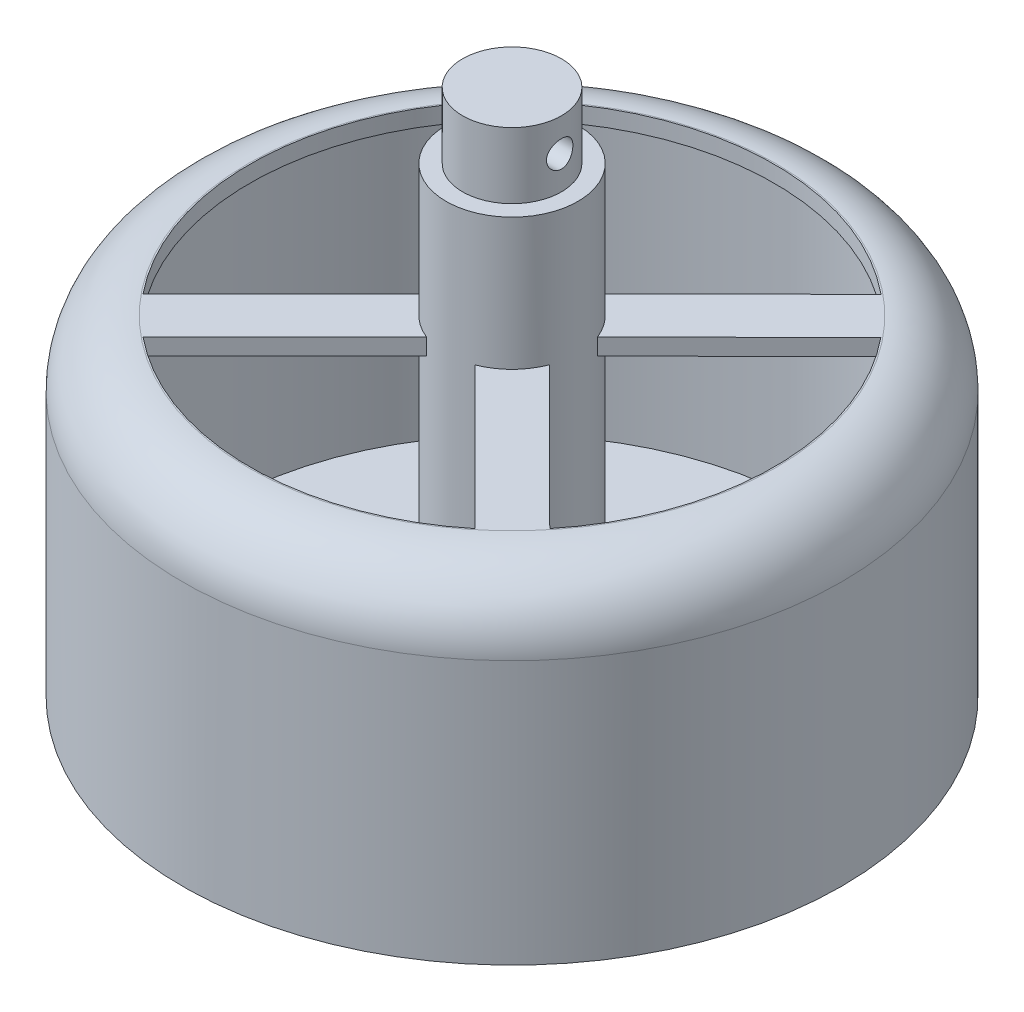
ISO-10303-21;
HEADER;
FILE_DESCRIPTION(('STEP AP214'),'2;1');
FILE_NAME('part.step','',(''),(''),'','','');
FILE_SCHEMA(('AUTOMOTIVE_DESIGN { 1 0 10303 214 1 1 1 1 }'));
ENDSEC;
DATA;
#1=APPLICATION_CONTEXT('core data for automotive mechanical design processes');
#2=APPLICATION_PROTOCOL_DEFINITION('international standard','automotive_design',2000,#1);
#3=PRODUCT_CONTEXT('',#1,'mechanical');
#4=PRODUCT('Part','Part','',(#3));
#5=PRODUCT_RELATED_PRODUCT_CATEGORY('part','',(#4));
#6=PRODUCT_DEFINITION_FORMATION('','',#4);
#7=PRODUCT_DEFINITION_CONTEXT('part definition',#1,'design');
#8=PRODUCT_DEFINITION('design','',#6,#7);
#9=PRODUCT_DEFINITION_SHAPE('','',#8);
#10=(LENGTH_UNIT() NAMED_UNIT(*) SI_UNIT(.MILLI.,.METRE.));
#11=(NAMED_UNIT(*) PLANE_ANGLE_UNIT() SI_UNIT($,.RADIAN.));
#12=(NAMED_UNIT(*) SI_UNIT($,.STERADIAN.) SOLID_ANGLE_UNIT());
#13=UNCERTAINTY_MEASURE_WITH_UNIT(LENGTH_MEASURE(1.E-05),#10,'distance_accuracy_value','');
#14=(GEOMETRIC_REPRESENTATION_CONTEXT(3) GLOBAL_UNCERTAINTY_ASSIGNED_CONTEXT((#13)) GLOBAL_UNIT_ASSIGNED_CONTEXT((#10,
#11,#12)) REPRESENTATION_CONTEXT('',''));
#15=CARTESIAN_POINT('',(0.,0.,0.));
#16=DIRECTION('',(0.,0.,1.));
#17=DIRECTION('',(1.,0.,0.));
#18=AXIS2_PLACEMENT_3D('',#15,#16,#17);
#19=CARTESIAN_POINT('',(50.,25.0000000000001,0.));
#20=DIRECTION('',(0.,1.,0.));
#21=DIRECTION('',(-1.,0.,0.));
#22=AXIS2_PLACEMENT_3D('',#19,#20,#21);
#23=PLANE('',#22);
#24=CARTESIAN_POINT('',(-1.70002900645727E-13,24.9999999999999,0.));
#25=DIRECTION('',(0.,1.,0.));
#26=DIRECTION('',(-1.,0.,0.));
#27=AXIS2_PLACEMENT_3D('',#24,#25,#26);
#28=CIRCLE('',#27,40.0000000000001);
#29=CARTESIAN_POINT('',(-40.0000000000002,24.9999999999998,0.));
#30=VERTEX_POINT('',#29);
#31=EDGE_CURVE('E150',#30,#30,#28,.T.);
#32=ORIENTED_EDGE('',*,*,#31,.T.);
#33=EDGE_LOOP('',(#32));
#34=FACE_BOUND('',#33,.T.);
#35=CARTESIAN_POINT('',(0.,24.9999999999999,0.));
#36=DIRECTION('',(0.,1.,0.));
#37=DIRECTION('',(-1.,0.,0.));
#38=AXIS2_PLACEMENT_3D('',#35,#36,#37);
#39=CIRCLE('',#38,39.7856298685077);
#40=CARTESIAN_POINT('',(-25.1987849511295,24.9999999999999,30.7882701855856));
#41=VERTEX_POINT('',#40);
#42=CARTESIAN_POINT('',(25.1987849511294,25.,30.7882701855856));
#43=VERTEX_POINT('',#42);
#44=EDGE_CURVE('E554',#41,#43,#39,.T.);
#45=ORIENTED_EDGE('',*,*,#44,.F.);
#46=DIRECTION('',(0.707957179278393,0.,-0.706255359135901));
#47=VECTOR('',#46,1.);
#48=CARTESIAN_POINT('',(2.82502143654353,24.9999999999999,2.83182871711357));
#49=LINE('',#48,#47);
#50=CARTESIAN_POINT('',(-3.66351328911779,24.9999999999999,9.30476600353055));
#51=VERTEX_POINT('',#50);
#52=EDGE_CURVE('E157',#41,#51,#49,.T.);
#53=ORIENTED_EDGE('',*,*,#52,.T.);
#54=CARTESIAN_POINT('',(0.,24.9999999999999,0.));
#55=DIRECTION('',(0.,1.,0.));
#56=DIRECTION('',(-1.,0.,0.));
#57=AXIS2_PLACEMENT_3D('',#54,#55,#56);
#58=CIRCLE('',#57,10.);
#59=CARTESIAN_POINT('',(-9.313556162205,24.9999999999999,3.64110856930341));
#60=VERTEX_POINT('',#59);
#61=EDGE_CURVE('E339',#60,#51,#58,.T.);
#62=ORIENTED_EDGE('',*,*,#61,.F.);
#63=DIRECTION('',(-0.707957179278394,0.,0.706255359135901));
#64=VECTOR('',#63,1.);
#65=CARTESIAN_POINT('',(-2.82502143654367,24.9999999999999,-2.83182871711357));
#66=LINE('',#65,#64);
#67=CARTESIAN_POINT('',(-30.8488278242167,24.9999999999998,25.1246127513585));
#68=VERTEX_POINT('',#67);
#69=EDGE_CURVE('E536',#60,#68,#66,.T.);
#70=ORIENTED_EDGE('',*,*,#69,.T.);
#71=CARTESIAN_POINT('',(0.,24.9999999999999,0.));
#72=DIRECTION('',(0.,1.,0.));
#73=DIRECTION('',(-1.,0.,0.));
#74=AXIS2_PLACEMENT_3D('',#71,#72,#73);
#75=CIRCLE('',#74,39.7856298685077);
#76=CARTESIAN_POINT('',(-30.8488278242167,24.9999999999998,-25.1246127513585));
#77=VERTEX_POINT('',#76);
#78=EDGE_CURVE('E530',#77,#68,#75,.T.);
#79=ORIENTED_EDGE('',*,*,#78,.F.);
#80=DIRECTION('',(-0.707957179278394,0.,-0.706255359135901));
#81=VECTOR('',#80,1.);
#82=CARTESIAN_POINT('',(-2.82502143654367,24.9999999999999,2.83182871711357));
#83=LINE('',#82,#81);
#84=CARTESIAN_POINT('',(-9.313556162205,24.9999999999999,-3.64110856930341));
#85=VERTEX_POINT('',#84);
#86=EDGE_CURVE('E270',#85,#77,#83,.T.);
#87=ORIENTED_EDGE('',*,*,#86,.F.);
#88=CARTESIAN_POINT('',(-3.66351328911779,24.9999999999999,-9.30476600353055));
#89=VERTEX_POINT('',#88);
#90=EDGE_CURVE('E344',#89,#85,#58,.T.);
#91=ORIENTED_EDGE('',*,*,#90,.F.);
#92=DIRECTION('',(0.707957179278393,0.,0.706255359135901));
#93=VECTOR('',#92,1.);
#94=CARTESIAN_POINT('',(2.82502143654353,24.9999999999999,-2.83182871711357));
#95=LINE('',#94,#93);
#96=CARTESIAN_POINT('',(-25.1987849511295,24.9999999999999,-30.7882701855856));
#97=VERTEX_POINT('',#96);
#98=EDGE_CURVE('E292',#97,#89,#95,.T.);
#99=ORIENTED_EDGE('',*,*,#98,.F.);
#100=CARTESIAN_POINT('',(0.,24.9999999999999,0.));
#101=DIRECTION('',(0.,1.,0.));
#102=DIRECTION('',(-1.,0.,0.));
#103=AXIS2_PLACEMENT_3D('',#100,#101,#102);
#104=CIRCLE('',#103,39.7856298685077);
#105=CARTESIAN_POINT('',(25.1987849511294,25.,-30.7882701855856));
#106=VERTEX_POINT('',#105);
#107=EDGE_CURVE('E287',#106,#97,#104,.T.);
#108=ORIENTED_EDGE('',*,*,#107,.F.);
#109=DIRECTION('',(-0.707957179278394,0.,0.706255359135901));
#110=VECTOR('',#109,1.);
#111=CARTESIAN_POINT('',(-2.82502143654368,24.9999999999999,-2.83182871711358));
#112=LINE('',#111,#110);
#113=CARTESIAN_POINT('',(3.66351328911764,24.9999999999999,-9.30476600353055));
#114=VERTEX_POINT('',#113);
#115=EDGE_CURVE('E307',#106,#114,#112,.T.);
#116=ORIENTED_EDGE('',*,*,#115,.T.);
#117=CARTESIAN_POINT('',(9.31355616220485,25.,-3.64110856930341));
#118=VERTEX_POINT('',#117);
#119=EDGE_CURVE('E514',#118,#114,#58,.T.);
#120=ORIENTED_EDGE('',*,*,#119,.F.);
#121=DIRECTION('',(0.707957179278394,0.,-0.706255359135901));
#122=VECTOR('',#121,1.);
#123=CARTESIAN_POINT('',(2.82502143654353,24.9999999999999,2.83182871711357));
#124=LINE('',#123,#122);
#125=CARTESIAN_POINT('',(30.8488278242166,25.,-25.1246127513585));
#126=VERTEX_POINT('',#125);
#127=EDGE_CURVE('E297',#118,#126,#124,.T.);
#128=ORIENTED_EDGE('',*,*,#127,.T.);
#129=CARTESIAN_POINT('',(0.,24.9999999999999,0.));
#130=DIRECTION('',(0.,1.,0.));
#131=DIRECTION('',(-1.,0.,0.));
#132=AXIS2_PLACEMENT_3D('',#129,#130,#131);
#133=CIRCLE('',#132,39.7856298685077);
#134=CARTESIAN_POINT('',(30.8488278242166,25.,25.1246127513585));
#135=VERTEX_POINT('',#134);
#136=EDGE_CURVE('E575',#135,#126,#133,.T.);
#137=ORIENTED_EDGE('',*,*,#136,.F.);
#138=DIRECTION('',(0.707957179278394,0.,0.706255359135901));
#139=VECTOR('',#138,1.);
#140=CARTESIAN_POINT('',(2.82502143654353,24.9999999999999,-2.83182871711357));
#141=LINE('',#140,#139);
#142=CARTESIAN_POINT('',(9.31355616220485,25.,3.64110856930341));
#143=VERTEX_POINT('',#142);
#144=EDGE_CURVE('E165',#143,#135,#141,.T.);
#145=ORIENTED_EDGE('',*,*,#144,.F.);
#146=CARTESIAN_POINT('',(3.66351328911764,24.9999999999999,9.30476600353055));
#147=VERTEX_POINT('',#146);
#148=EDGE_CURVE('E285',#147,#143,#58,.T.);
#149=ORIENTED_EDGE('',*,*,#148,.F.);
#150=DIRECTION('',(-0.707957179278394,0.,-0.706255359135901));
#151=VECTOR('',#150,1.);
#152=CARTESIAN_POINT('',(-2.82502143654368,24.9999999999999,2.83182871711358));
#153=LINE('',#152,#151);
#154=EDGE_CURVE('E558',#43,#147,#153,.T.);
#155=ORIENTED_EDGE('',*,*,#154,.F.);
#156=EDGE_LOOP('',(#45,#53,#62,#70,#79,#87,#91,#99,#108,#116,#120,#128,#137,#145,#149,#155));
#157=FACE_BOUND('',#156,.T.);
#158=ADVANCED_FACE('F141',(#34,#157),#23,.T.);
#159=CARTESIAN_POINT('',(-1.28022592527089E-13,45.,0.));
#160=DIRECTION('',(0.,1.,0.));
#161=DIRECTION('',(-1.,0.,0.));
#162=AXIS2_PLACEMENT_3D('',#159,#160,#161);
#163=CYLINDRICAL_SURFACE('',#162,7.5);
#164=CARTESIAN_POINT('',(7.22841614740034,50.,2.));
#165=CARTESIAN_POINT('',(7.22841805697237,50.1101759377402,1.99999734315871));
#166=CARTESIAN_POINT('',(7.23096264549659,50.220380000476,1.99086493224743));
#167=CARTESIAN_POINT('',(7.24083561155082,50.4376054215563,1.95464583260237));
#168=CARTESIAN_POINT('',(7.24816638907919,50.544625154978,1.92755013620952));
#169=CARTESIAN_POINT('',(7.26672375176824,50.7523080699467,1.85635845560073));
#170=CARTESIAN_POINT('',(7.27794485684189,50.8529799588284,1.81228637542178));
#171=CARTESIAN_POINT('',(7.30301154920387,51.0455167400598,1.70846784563704));
#172=CARTESIAN_POINT('',(7.31685734034409,51.1373809475069,1.6487201784145));
#173=CARTESIAN_POINT('',(7.34600139553452,51.3119925469877,1.51364847874559));
#174=CARTESIAN_POINT('',(7.36132541116428,51.3944870174644,1.43800297504208));
#175=CARTESIAN_POINT('',(7.39147701436492,51.5457815769511,1.27397427284021));
#176=CARTESIAN_POINT('',(7.40630455033424,51.6145802461417,1.18558975534664));
#177=CARTESIAN_POINT('',(7.43407988468404,51.7375849384029,0.996838170873268));
#178=CARTESIAN_POINT('',(7.44699376262278,51.7915395186328,0.896301819879479));
#179=CARTESIAN_POINT('',(7.46919126211819,51.8816846353672,0.68718304472909));
#180=CARTESIAN_POINT('',(7.47847549576247,51.9178781672815,0.578601980875103));
#181=CARTESIAN_POINT('',(7.49218553576447,51.9706552202357,0.359115961810089));
#182=CARTESIAN_POINT('',(7.4967177675025,51.9876689766259,0.248321224200915));
#183=CARTESIAN_POINT('',(7.50078524617735,52.0029571201071,0.025363553508575));
#184=CARTESIAN_POINT('',(7.50032132946593,52.0012346436301,-0.0867991474385301));
#185=CARTESIAN_POINT('',(7.4945267585975,51.9794021874605,-0.306314237111347));
#186=CARTESIAN_POINT('',(7.48931914026984,51.9597570423637,-0.413716600721112));
#187=CARTESIAN_POINT('',(7.47476748590455,51.903387862218,-0.623641315571057));
#188=CARTESIAN_POINT('',(7.46542321400575,51.8666628533139,-0.726163388180582));
#189=CARTESIAN_POINT('',(7.44346569099877,51.7768201524076,-0.924603945147555));
#190=CARTESIAN_POINT('',(7.43082087877657,51.7235431928992,-1.02044668632954));
#191=CARTESIAN_POINT('',(7.40362468509489,51.6022311804909,-1.20198999876452));
#192=CARTESIAN_POINT('',(7.38907293222985,51.5341932509718,-1.28768858808586));
#193=CARTESIAN_POINT('',(7.35911272938704,51.382823142066,-1.44928536946561));
#194=CARTESIAN_POINT('',(7.34369169368724,51.2990855549506,-1.52480192017773));
#195=CARTESIAN_POINT('',(7.31413405023506,51.1199753237611,-1.66081332104769));
#196=CARTESIAN_POINT('',(7.29999752083051,51.0246019707995,-1.72130725529808));
#197=CARTESIAN_POINT('',(7.27455902280762,50.8240998981786,-1.82584679186274));
#198=CARTESIAN_POINT('',(7.26327507092141,50.7189146490868,-1.86978866600526));
#199=CARTESIAN_POINT('',(7.24504325087501,50.502273500545,-1.93924001685674));
#200=CARTESIAN_POINT('',(7.23809430746831,50.3908191635496,-1.96475406461341));
#201=CARTESIAN_POINT('',(7.22954835612961,50.1683727889716,-1.99596757092855));
#202=CARTESIAN_POINT('',(7.22779763213442,50.0574664513786,-2.00223632621177));
#203=CARTESIAN_POINT('',(7.22942578390801,49.8361902271914,-1.9963498112297));
#204=CARTESIAN_POINT('',(7.23280411376424,49.72582028476,-1.98419650172322));
#205=CARTESIAN_POINT('',(7.24416124318851,49.5109434059084,-1.94231271869971));
#206=CARTESIAN_POINT('',(7.25205039699285,49.4063645620627,-1.91292447912922));
#207=CARTESIAN_POINT('',(7.2714526895277,49.20362036864,-1.83778986725474));
#208=CARTESIAN_POINT('',(7.28296630148549,49.1054558585725,-1.79204135876651));
#209=CARTESIAN_POINT('',(7.3086357247297,48.9159450425647,-1.68432905508707));
#210=CARTESIAN_POINT('',(7.3228440487285,48.8247960241102,-1.62203095237924));
#211=CARTESIAN_POINT('',(7.35217841933652,48.6540366982968,-1.48340227987515));
#212=CARTESIAN_POINT('',(7.36730463810224,48.5744285650458,-1.40706907222966));
#213=CARTESIAN_POINT('',(7.39729964884442,48.42664752675,-1.23990378250484));
#214=CARTESIAN_POINT('',(7.41214836523835,48.3588716230214,-1.14871641600884));
#215=CARTESIAN_POINT('',(7.43946670017113,48.2395890125894,-0.955928435940741));
#216=CARTESIAN_POINT('',(7.45193644532891,48.188081439921,-0.854328377018883));
#217=CARTESIAN_POINT('',(7.47301150899247,48.1032703676384,-0.644314134825873));
#218=CARTESIAN_POINT('',(7.48164558480371,48.0698309805565,-0.535957852882338));
#219=CARTESIAN_POINT('',(7.49420303787233,48.0217112719356,-0.31489938473132));
#220=CARTESIAN_POINT('',(7.49812745904966,48.0070267932253,-0.202198167320242));
#221=CARTESIAN_POINT('',(7.50077413437678,47.9970941762585,0.0206420013461514));
#222=CARTESIAN_POINT('',(7.49965226288069,48.0012636808688,0.130753511527865));
#223=CARTESIAN_POINT('',(7.49268490978846,48.0275684935752,0.348648304630718));
#224=CARTESIAN_POINT('',(7.48683960554772,48.049703127117,0.456431674812815));
#225=CARTESIAN_POINT('',(7.47111310390909,48.1109806049185,0.66591012346421));
#226=CARTESIAN_POINT('',(7.46125997189216,48.1500052934724,0.767642011851539));
#227=CARTESIAN_POINT('',(7.4385481651648,48.2438496017462,0.963172098471352));
#228=CARTESIAN_POINT('',(7.42568906899239,48.2986714366128,1.05696918166215));
#229=CARTESIAN_POINT('',(7.39791331224108,48.424258272137,1.23667826867367));
#230=CARTESIAN_POINT('',(7.38295093371621,48.4954093806986,1.32231336173331));
#231=CARTESIAN_POINT('',(7.35284000077242,48.6509027493649,1.48062537156133));
#232=CARTESIAN_POINT('',(7.33769139839707,48.7352484758193,1.55329887243048));
#233=CARTESIAN_POINT('',(7.30853959638842,48.9169683958175,1.68520700232561));
#234=CARTESIAN_POINT('',(7.29456891224632,49.0145883136572,1.74411094261233));
#235=CARTESIAN_POINT('',(7.26981393903458,49.2187063108602,1.84458689030054));
#236=CARTESIAN_POINT('',(7.25902756724933,49.3251985285394,1.88617023367332));
#237=CARTESIAN_POINT('',(7.2433600065386,49.5260813360512,1.94538124252481));
#238=CARTESIAN_POINT('',(7.23780140272181,49.6196012645567,1.96581518399489));
#239=CARTESIAN_POINT('',(7.23032885211556,49.8087405579939,1.9931249429388));
#240=CARTESIAN_POINT('',(7.22841448976002,49.9043596822888,2.0000023063216));
#241=CARTESIAN_POINT('',(7.22841614740034,50.,2.));
#242=B_SPLINE_CURVE_WITH_KNOTS('',3,(#164,#165,#166,#167,#168,#169,#170,#171,#172,#173,#174,
#175,#176,#177,#178,#179,#180,#181,#182,#183,#184,#185,#186,#187,#188,#189,#190,#191,#192,#193,
#194,#195,#196,#197,#198,#199,#200,#201,#202,#203,#204,#205,#206,#207,#208,#209,#210,#211,#212,
#213,#214,#215,#216,#217,#218,#219,#220,#221,#222,#223,#224,#225,#226,#227,#228,#229,#230,#231,
#232,#233,#234,#235,#236,#237,#238,#239,#240,#241),.UNSPECIFIED.,.T.,.F.,(4,2,2,2,2,2,2,2,2,2,2,
2,2,2,2,2,2,2,2,2,2,2,2,2,2,2,2,2,2,2,2,2,2,2,2,2,2,2,4),(0.,0.33017612811603,0.660517947850204,
0.99039631159616,1.32030030656104,1.65765916130211,1.99505297124461,2.33785207370803,
2.68059334304246,3.0154830431648,3.35031668385603,3.67670570800803,4.00311334440696,
4.3327644890557,4.66247993394491,5.00231762300329,5.34217602639579,5.68413015096536,
6.02599942418508,6.35765334242024,6.68927196343503,7.01451850432575,7.33980752864823,
7.67224634967772,8.00474771541475,8.34685906959633,8.68895221008103,9.02843539591401,
9.36784331959006,9.69684054916463,10.0258254261296,10.3525451486866,10.6793107076596,
11.0147885399158,11.3503546538105,11.6933003898558,12.0360213210131,12.3226696767153,
12.6092853429065),.UNSPECIFIED.);
#243=CARTESIAN_POINT('',(7.22841614740034,50.,2.));
#244=VERTEX_POINT('',#243);
#245=EDGE_CURVE('E315',#244,#244,#242,.T.);
#246=ORIENTED_EDGE('',*,*,#245,.T.);
#247=EDGE_LOOP('',(#246));
#248=FACE_BOUND('',#247,.T.);
#249=CARTESIAN_POINT('',(-1.28022592527089E-13,45.,0.));
#250=DIRECTION('',(0.,1.,0.));
#251=DIRECTION('',(-1.,0.,0.));
#252=AXIS2_PLACEMENT_3D('',#249,#250,#251);
#253=CIRCLE('',#252,7.5);
#254=CARTESIAN_POINT('',(-7.50000000000013,44.9999999999999,0.));
#255=VERTEX_POINT('',#254);
#256=EDGE_CURVE('E325',#255,#255,#253,.T.);
#257=ORIENTED_EDGE('',*,*,#256,.T.);
#258=EDGE_LOOP('',(#257));
#259=FACE_BOUND('',#258,.T.);
#260=CARTESIAN_POINT('',(-1.56472057533108E-13,54.9999999999999,0.));
#261=DIRECTION('',(0.,1.,0.));
#262=DIRECTION('',(-1.,0.,0.));
#263=AXIS2_PLACEMENT_3D('',#260,#261,#262);
#264=CIRCLE('',#263,7.5);
#265=CARTESIAN_POINT('',(-7.50000000000016,54.9999999999999,0.));
#266=VERTEX_POINT('',#265);
#267=EDGE_CURVE('E330',#266,#266,#264,.T.);
#268=ORIENTED_EDGE('',*,*,#267,.F.);
#269=EDGE_LOOP('',(#268));
#270=FACE_BOUND('',#269,.T.);
#271=CARTESIAN_POINT('',(-7.50000000000014,47.9999999999999,0.));
#272=CARTESIAN_POINT('',(-7.49999833810175,48.0000026169348,-0.110254555832854));
#273=CARTESIAN_POINT('',(-7.49754486162164,48.0091476141896,-0.22053716022184));
#274=CARTESIAN_POINT('',(-7.48799573621673,48.0454212307386,-0.437925451354464));
#275=CARTESIAN_POINT('',(-7.480897853326,48.0725585044261,-0.545029583319087));
#276=CARTESIAN_POINT('',(-7.46284333252804,48.143871666864,-0.752891589045312));
#277=CARTESIAN_POINT('',(-7.45189167130389,48.188025587666,-0.853657451015282));
#278=CARTESIAN_POINT('',(-7.42728699151692,48.2920372426666,-1.04635368639266));
#279=CARTESIAN_POINT('',(-7.41363379295194,48.3518960233592,-1.13828347044962));
#280=CARTESIAN_POINT('',(-7.38474614902008,48.4870835164133,-1.31282950374002));
#281=CARTESIAN_POINT('',(-7.36948467678695,48.5627086680082,-1.39521168986279));
#282=CARTESIAN_POINT('',(-7.33927409679605,48.7266484830633,-1.54628713660638));
#283=CARTESIAN_POINT('',(-7.32432502947257,48.8149647776175,-1.61497863495665));
#284=CARTESIAN_POINT('',(-7.29615537464386,49.0036482348254,-1.73786409243415));
#285=CARTESIAN_POINT('',(-7.28296888563253,49.1041963282617,-1.79178877736488));
#286=CARTESIAN_POINT('',(-7.26021477318201,49.3133401110924,-1.88187548076994));
#287=CARTESIAN_POINT('',(-7.25064648253279,49.4219343123314,-1.91804077451369));
#288=CARTESIAN_POINT('',(-7.23649115802413,49.641495537825,-1.97076920226504));
#289=CARTESIAN_POINT('',(-7.23179647811504,49.7523535399307,-1.98775670244692));
#290=CARTESIAN_POINT('',(-7.22759830916385,49.9754376833065,-2.0029703470582));
#291=CARTESIAN_POINT('',(-7.2280938501446,50.087663565024,-2.00119999705753));
#292=CARTESIAN_POINT('',(-7.23412378802045,50.306985415374,-1.97928510002699));
#293=CARTESIAN_POINT('',(-7.23951735511545,50.4141371820384,-1.95965406064765));
#294=CARTESIAN_POINT('',(-7.25451013080702,50.6235683344562,-1.90339748722183));
#295=CARTESIAN_POINT('',(-7.26410967552627,50.7258473300753,-1.86677059492995));
#296=CARTESIAN_POINT('',(-7.28655661748401,50.9239681438085,-1.77714356965256));
#297=CARTESIAN_POINT('',(-7.29943942818717,51.0197243392862,-1.72396341137784));
#298=CARTESIAN_POINT('',(-7.32698229642459,51.2011341588515,-1.60286503823778));
#299=CARTESIAN_POINT('',(-7.34164270355201,51.2867857891564,-1.53494392224251));
#300=CARTESIAN_POINT('',(-7.37167510629878,51.4484889974548,-1.38366607263419));
#301=CARTESIAN_POINT('',(-7.38705471488845,51.5241363183149,-1.29987812728299));
#302=CARTESIAN_POINT('',(-7.41636381276331,51.6603887803502,-1.12061766820637));
#303=CARTESIAN_POINT('',(-7.43029324488569,51.7209933287024,-1.02514469420509));
#304=CARTESIAN_POINT('',(-7.45521820398308,51.8256179028246,-0.824598255497455));
#305=CARTESIAN_POINT('',(-7.46620072833575,51.8695647704485,-0.719484902551792));
#306=CARTESIAN_POINT('',(-7.48390044401014,51.9390471888133,-0.503002294390397));
#307=CARTESIAN_POINT('',(-7.49061856733764,51.9645867627239,-0.391634411928326));
#308=CARTESIAN_POINT('',(-7.49889158558399,51.9958948769178,-0.169254083145517));
#309=CARTESIAN_POINT('',(-7.50058997470974,52.0022130398508,-0.0583242376413815));
#310=CARTESIAN_POINT('',(-7.4990447169171,51.996416835753,0.163010045901198));
#311=CARTESIAN_POINT('',(-7.49580158080367,51.9843043738942,0.273414537062114));
#312=CARTESIAN_POINT('',(-7.48483035496036,51.94244155254,0.48860244990178));
#313=CARTESIAN_POINT('',(-7.47718026546344,51.9129977538022,0.593449852027782));
#314=CARTESIAN_POINT('',(-7.45826294894154,51.837664055492,0.796706971176064));
#315=CARTESIAN_POINT('',(-7.44699532996176,51.7917723737494,0.895115989216026));
#316=CARTESIAN_POINT('',(-7.42175660559543,51.6838261128194,1.08483847466795));
#317=CARTESIAN_POINT('',(-7.40773686604971,51.6214725332022,1.17597518846118));
#318=CARTESIAN_POINT('',(-7.37861452365578,51.482748369842,1.34668463539714));
#319=CARTESIAN_POINT('',(-7.36351170727535,51.4063750173989,1.42625507879918));
#320=CARTESIAN_POINT('',(-7.33339745866719,51.2392144225054,1.57388924478774));
#321=CARTESIAN_POINT('',(-7.31840061429327,51.1480814386048,1.64156519249816));
#322=CARTESIAN_POINT('',(-7.29066447182742,50.9554353039003,1.76067191185118));
#323=CARTESIAN_POINT('',(-7.27792507956331,50.8539225863776,1.81210336122161));
#324=CARTESIAN_POINT('',(-7.25629268373224,50.6439046929238,1.89687411586112));
#325=CARTESIAN_POINT('',(-7.24737748318023,50.5354441881824,1.93031812253958));
#326=CARTESIAN_POINT('',(-7.23439825126815,50.3141606803252,1.97841205118791));
#327=CARTESIAN_POINT('',(-7.23033298020028,50.201338799652,1.99306677602478));
#328=CARTESIAN_POINT('',(-7.22761744573603,49.9785052121162,2.00288989653714));
#329=CARTESIAN_POINT('',(-7.22879397743253,49.8685226797417,1.99868155618109));
#330=CARTESIAN_POINT('',(-7.23602396081101,49.6508964859899,1.97234376000439));
#331=CARTESIAN_POINT('',(-7.24207728699453,49.5432527644994,1.95021476535025));
#332=CARTESIAN_POINT('',(-7.25827571073172,49.3341442478701,1.88902515699699));
#333=CARTESIAN_POINT('',(-7.26838885019658,49.2326381572678,1.8500966107558));
#334=CARTESIAN_POINT('',(-7.29156818136191,49.0375211694658,1.75651554562386));
#335=CARTESIAN_POINT('',(-7.30463483621378,48.9439115136994,1.70186056024617));
#336=CARTESIAN_POINT('',(-7.33272921440474,48.7642696405033,1.57648909268817));
#337=CARTESIAN_POINT('',(-7.34780333101704,48.6785414650237,1.50534729767909));
#338=CARTESIAN_POINT('',(-7.37795503783021,48.5200375483326,1.349830535111));
#339=CARTESIAN_POINT('',(-7.39303262798455,48.4472649613311,1.26545235435875));
#340=CARTESIAN_POINT('',(-7.42187812403982,48.3152077623531,1.08367998108869));
#341=CARTESIAN_POINT('',(-7.43561111314564,48.2562449893506,0.986045961751778));
#342=CARTESIAN_POINT('',(-7.45983810102911,48.1556625840706,0.781888640416887));
#343=CARTESIAN_POINT('',(-7.47033417683608,48.1140318243363,0.675371094696294));
#344=CARTESIAN_POINT('',(-7.48554752513481,48.0547247145844,0.474374704880988));
#345=CARTESIAN_POINT('',(-7.49092770592616,48.0342506164075,0.380762016565034));
#346=CARTESIAN_POINT('',(-7.4981544903647,48.0068877938329,0.191439795317076));
#347=CARTESIAN_POINT('',(-7.50000144297284,47.9999977277999,0.0957304704048601));
#348=CARTESIAN_POINT('',(-7.50000000000014,47.9999999999999,0.));
#349=B_SPLINE_CURVE_WITH_KNOTS('',3,(#271,#272,#273,#274,#275,#276,#277,#278,#279,#280,#281,
#282,#283,#284,#285,#286,#287,#288,#289,#290,#291,#292,#293,#294,#295,#296,#297,#298,#299,#300,
#301,#302,#303,#304,#305,#306,#307,#308,#309,#310,#311,#312,#313,#314,#315,#316,#317,#318,#319,
#320,#321,#322,#323,#324,#325,#326,#327,#328,#329,#330,#331,#332,#333,#334,#335,#336,#337,#338,
#339,#340,#341,#342,#343,#344,#345,#346,#347,#348),.UNSPECIFIED.,.T.,.F.,(4,2,2,2,2,2,2,2,2,2,2,
2,2,2,2,2,2,2,2,2,2,2,2,2,2,2,2,2,2,2,2,2,2,2,2,2,2,2,4),(0.,0.330412598949569,0.66098424376145,
0.99113055297193,1.32129886708675,1.65834897954967,1.99544244925149,2.33832582523229,
2.68114594129699,3.01622158250469,3.3512346040432,3.67691002045996,4.00261146812939,
4.33198673346498,4.6614268811763,5.00161259812322,5.34181171937597,5.68348809603041,
6.02508977190138,6.35682717524547,6.68853028925351,7.01453535642116,7.34057575775614,
7.6730028600455,8.00549568258886,8.34736496382788,8.68921998024107,9.02906297699387,
9.36881908663982,9.69743342403611,10.0260393052059,10.352107654483,10.67822717123,
11.0139433957139,11.3497412433245,11.692722522809,12.0354832614518,12.3223981899334,
12.6092847796638),.UNSPECIFIED.);
#350=CARTESIAN_POINT('',(-7.50000000000014,47.9999999999999,0.));
#351=VERTEX_POINT('',#350);
#352=EDGE_CURVE('E334',#351,#351,#349,.T.);
#353=ORIENTED_EDGE('',*,*,#352,.T.);
#354=EDGE_LOOP('',(#353));
#355=FACE_BOUND('',#354,.T.);
#356=ADVANCED_FACE('F368',(#248,#259,#270,#355),#163,.T.);
#357=CARTESIAN_POINT('',(-1.56472057533108E-13,54.9999999999999,0.));
#358=DIRECTION('',(0.,-1.,0.));
#359=DIRECTION('',(1.,0.,0.));
#360=AXIS2_PLACEMENT_3D('',#357,#358,#359);
#361=CYLINDRICAL_SURFACE('',#360,10.);
#362=CARTESIAN_POINT('',(0.,22.4999999999999,0.));
#363=DIRECTION('',(0.,-1.,0.));
#364=DIRECTION('',(1.,0.,0.));
#365=AXIS2_PLACEMENT_3D('',#362,#363,#364);
#366=CIRCLE('',#365,10.);
#367=CARTESIAN_POINT('',(9.31355616220486,22.5,3.64110856930341));
#368=VERTEX_POINT('',#367);
#369=CARTESIAN_POINT('',(3.66351328911765,22.4999999999999,9.30476600353055));
#370=VERTEX_POINT('',#369);
#371=EDGE_CURVE('E257',#368,#370,#366,.T.);
#372=ORIENTED_EDGE('',*,*,#371,.T.);
#373=DIRECTION('',(0.,1.,0.));
#374=VECTOR('',#373,1.);
#375=CARTESIAN_POINT('',(3.66351328911767,15.,9.30476600353055));
#376=LINE('',#375,#374);
#377=EDGE_CURVE('E566',#370,#147,#376,.T.);
#378=ORIENTED_EDGE('',*,*,#377,.T.);
#379=ORIENTED_EDGE('',*,*,#148,.T.);
#380=DIRECTION('',(0.,1.,0.));
#381=VECTOR('',#380,1.);
#382=CARTESIAN_POINT('',(9.31355616220488,15.,3.64110856930341));
#383=LINE('',#382,#381);
#384=EDGE_CURVE('E275',#368,#143,#383,.T.);
#385=ORIENTED_EDGE('',*,*,#384,.F.);
#386=EDGE_LOOP('',(#372,#378,#379,#385));
#387=FACE_BOUND('',#386,.T.);
#388=CARTESIAN_POINT('',(-3.66351328911778,22.4999999999999,9.30476600353055));
#389=VERTEX_POINT('',#388);
#390=CARTESIAN_POINT('',(-9.31355616220499,22.4999999999999,3.64110856930341));
#391=VERTEX_POINT('',#390);
#392=EDGE_CURVE('E271',#389,#391,#366,.T.);
#393=ORIENTED_EDGE('',*,*,#392,.T.);
#394=DIRECTION('',(0.,1.,0.));
#395=VECTOR('',#394,1.);
#396=CARTESIAN_POINT('',(-9.31355616220497,14.9999999999999,3.64110856930341));
#397=LINE('',#396,#395);
#398=EDGE_CURVE('E544',#391,#60,#397,.T.);
#399=ORIENTED_EDGE('',*,*,#398,.T.);
#400=ORIENTED_EDGE('',*,*,#61,.T.);
#401=DIRECTION('',(0.,1.,0.));
#402=VECTOR('',#401,1.);
#403=CARTESIAN_POINT('',(-3.66351328911776,14.9999999999999,9.30476600353055));
#404=LINE('',#403,#402);
#405=EDGE_CURVE('E563',#389,#51,#404,.T.);
#406=ORIENTED_EDGE('',*,*,#405,.F.);
#407=EDGE_LOOP('',(#393,#399,#400,#406));
#408=FACE_BOUND('',#407,.T.);
#409=CARTESIAN_POINT('',(-9.31355616220499,22.4999999999999,-3.64110856930341));
#410=VERTEX_POINT('',#409);
#411=CARTESIAN_POINT('',(-3.66351328911778,22.4999999999999,-9.30476600353055));
#412=VERTEX_POINT('',#411);
#413=EDGE_CURVE('E588',#410,#412,#366,.T.);
#414=ORIENTED_EDGE('',*,*,#413,.T.);
#415=DIRECTION('',(0.,1.,0.));
#416=VECTOR('',#415,1.);
#417=CARTESIAN_POINT('',(-3.66351328911776,14.9999999999999,-9.30476600353055));
#418=LINE('',#417,#416);
#419=EDGE_CURVE('E319',#412,#89,#418,.T.);
#420=ORIENTED_EDGE('',*,*,#419,.T.);
#421=ORIENTED_EDGE('',*,*,#90,.T.);
#422=DIRECTION('',(0.,1.,0.));
#423=VECTOR('',#422,1.);
#424=CARTESIAN_POINT('',(-9.31355616220497,14.9999999999999,-3.64110856930341));
#425=LINE('',#424,#423);
#426=EDGE_CURVE('E524',#410,#85,#425,.T.);
#427=ORIENTED_EDGE('',*,*,#426,.F.);
#428=EDGE_LOOP('',(#414,#420,#421,#427));
#429=FACE_BOUND('',#428,.T.);
#430=DIRECTION('',(0.,1.,0.));
#431=VECTOR('',#430,1.);
#432=CARTESIAN_POINT('',(3.66351328911767,15.,-9.30476600353055));
#433=LINE('',#432,#431);
#434=CARTESIAN_POINT('',(3.66351328911765,22.4999999999999,-9.30476600353055));
#435=VERTEX_POINT('',#434);
#436=EDGE_CURVE('E316',#435,#114,#433,.T.);
#437=ORIENTED_EDGE('',*,*,#436,.F.);
#438=CARTESIAN_POINT('',(9.31355616220486,22.5,-3.64110856930341));
#439=VERTEX_POINT('',#438);
#440=EDGE_CURVE('E273',#435,#439,#366,.T.);
#441=ORIENTED_EDGE('',*,*,#440,.T.);
#442=DIRECTION('',(0.,1.,0.));
#443=VECTOR('',#442,1.);
#444=CARTESIAN_POINT('',(9.31355616220488,15.,-3.64110856930341));
#445=LINE('',#444,#443);
#446=EDGE_CURVE('E288',#439,#118,#445,.T.);
#447=ORIENTED_EDGE('',*,*,#446,.T.);
#448=ORIENTED_EDGE('',*,*,#119,.T.);
#449=EDGE_LOOP('',(#437,#441,#447,#448));
#450=FACE_BOUND('',#449,.T.);
#451=CARTESIAN_POINT('',(-1.28022592527089E-13,45.,0.));
#452=DIRECTION('',(0.,1.,0.));
#453=DIRECTION('',(-1.,0.,0.));
#454=AXIS2_PLACEMENT_3D('',#451,#452,#453);
#455=CIRCLE('',#454,10.);
#456=CARTESIAN_POINT('',(-10.0000000000001,44.9999999999999,0.));
#457=VERTEX_POINT('',#456);
#458=EDGE_CURVE('E329',#457,#457,#455,.T.);
#459=ORIENTED_EDGE('',*,*,#458,.F.);
#460=EDGE_LOOP('',(#459));
#461=FACE_BOUND('',#460,.T.);
#462=CARTESIAN_POINT('',(0.,-22.5000000000001,0.));
#463=DIRECTION('',(0.,1.,0.));
#464=DIRECTION('',(-1.,0.,0.));
#465=AXIS2_PLACEMENT_3D('',#462,#463,#464);
#466=CIRCLE('',#465,10.);
#467=CARTESIAN_POINT('',(-9.99999999999994,-22.5000000000001,0.));
#468=VERTEX_POINT('',#467);
#469=EDGE_CURVE('E12',#468,#468,#466,.T.);
#470=ORIENTED_EDGE('',*,*,#469,.T.);
#471=EDGE_LOOP('',(#470));
#472=FACE_BOUND('',#471,.T.);
#473=ADVANCED_FACE('F282',(#387,#408,#429,#450,#461,#472),#361,.T.);
#474=CARTESIAN_POINT('',(0.,-25.,0.));
#475=DIRECTION('',(0.,-1.,0.));
#476=DIRECTION('',(1.,0.,0.));
#477=AXIS2_PLACEMENT_3D('',#474,#475,#476);
#478=CYLINDRICAL_SURFACE('',#477,50.0000000000001);
#479=CARTESIAN_POINT('',(-1.41553435639708E-13,14.9999999999999,0.));
#480=DIRECTION('',(0.,1.,0.));
#481=DIRECTION('',(-1.,0.,0.));
#482=AXIS2_PLACEMENT_3D('',#479,#480,#481);
#483=CIRCLE('',#482,50.0000000000001);
#484=CARTESIAN_POINT('',(-50.0000000000002,14.9999999999998,0.));
#485=VERTEX_POINT('',#484);
#486=EDGE_CURVE('E460',#485,#485,#483,.F.);
#487=ORIENTED_EDGE('',*,*,#486,.T.);
#488=EDGE_LOOP('',(#487));
#489=FACE_BOUND('',#488,.T.);
#490=CARTESIAN_POINT('',(0.,-25.0000000000001,0.));
#491=DIRECTION('',(0.,-1.,0.));
#492=DIRECTION('',(1.,0.,0.));
#493=AXIS2_PLACEMENT_3D('',#490,#491,#492);
#494=CIRCLE('',#493,50.);
#495=CARTESIAN_POINT('',(50.,-25.,0.));
#496=VERTEX_POINT('',#495);
#497=EDGE_CURVE('E352',#496,#496,#494,.T.);
#498=ORIENTED_EDGE('',*,*,#497,.F.);
#499=EDGE_LOOP('',(#498));
#500=FACE_BOUND('',#499,.T.);
#501=ADVANCED_FACE('F450',(#489,#500),#478,.T.);
#502=CARTESIAN_POINT('',(50.,-24.9999999999999,0.));
#503=DIRECTION('',(0.,-1.,0.));
#504=DIRECTION('',(1.,0.,0.));
#505=AXIS2_PLACEMENT_3D('',#502,#503,#504);
#506=PLANE('',#505);
#507=ORIENTED_EDGE('',*,*,#497,.T.);
#508=EDGE_LOOP('',(#507));
#509=FACE_BOUND('',#508,.T.);
#510=ADVANCED_FACE('F447',(#509),#506,.T.);
#511=CARTESIAN_POINT('',(-1.28022592527089E-13,45.,0.));
#512=DIRECTION('',(0.,1.,0.));
#513=DIRECTION('',(-1.,0.,0.));
#514=AXIS2_PLACEMENT_3D('',#511,#512,#513);
#515=PLANE('',#514);
#516=ORIENTED_EDGE('',*,*,#256,.F.);
#517=EDGE_LOOP('',(#516));
#518=FACE_BOUND('',#517,.T.);
#519=ORIENTED_EDGE('',*,*,#458,.T.);
#520=EDGE_LOOP('',(#519));
#521=FACE_BOUND('',#520,.T.);
#522=ADVANCED_FACE('F449',(#518,#521),#515,.T.);
#523=CARTESIAN_POINT('',(-1.56472057533108E-13,54.9999999999999,0.));
#524=DIRECTION('',(0.,1.,0.));
#525=DIRECTION('',(-1.,0.,0.));
#526=AXIS2_PLACEMENT_3D('',#523,#524,#525);
#527=PLANE('',#526);
#528=ORIENTED_EDGE('',*,*,#267,.T.);
#529=EDGE_LOOP('',(#528));
#530=FACE_BOUND('',#529,.T.);
#531=ADVANCED_FACE('F376',(#530),#527,.T.);
#532=CARTESIAN_POINT('',(9.99999999999998,50.,0.));
#533=DIRECTION('',(-1.,0.,0.));
#534=DIRECTION('',(0.,0.,1.));
#535=AXIS2_PLACEMENT_3D('',#532,#533,#534);
#536=CYLINDRICAL_SURFACE('',#535,2.);
#537=ORIENTED_EDGE('',*,*,#352,.F.);
#538=EDGE_LOOP('',(#537));
#539=FACE_BOUND('',#538,.T.);
#540=ORIENTED_EDGE('',*,*,#245,.F.);
#541=EDGE_LOOP('',(#540));
#542=FACE_BOUND('',#541,.T.);
#543=ADVANCED_FACE('F371',(#539,#542),#536,.F.);
#544=CARTESIAN_POINT('',(0.,15.,0.));
#545=DIRECTION('',(0.,1.,0.));
#546=DIRECTION('',(-1.,0.,0.));
#547=AXIS2_PLACEMENT_3D('',#544,#545,#546);
#548=CYLINDRICAL_SURFACE('',#547,39.7856298685077);
#549=CARTESIAN_POINT('',(0.,22.4999999999999,0.));
#550=DIRECTION('',(0.,-1.,0.));
#551=DIRECTION('',(1.,0.,0.));
#552=AXIS2_PLACEMENT_3D('',#549,#550,#551);
#553=CIRCLE('',#552,39.7856298685077);
#554=CARTESIAN_POINT('',(-25.1987849511295,22.4999999999999,-30.7882701855856));
#555=VERTEX_POINT('',#554);
#556=CARTESIAN_POINT('',(25.1987849511294,22.5,-30.7882701855856));
#557=VERTEX_POINT('',#556);
#558=EDGE_CURVE('E492',#555,#557,#553,.T.);
#559=ORIENTED_EDGE('',*,*,#558,.T.);
#560=DIRECTION('',(0.,1.,0.));
#561=VECTOR('',#560,1.);
#562=CARTESIAN_POINT('',(25.1987849511294,15.,-30.7882701855856));
#563=LINE('',#562,#561);
#564=EDGE_CURVE('E312',#557,#106,#563,.T.);
#565=ORIENTED_EDGE('',*,*,#564,.T.);
#566=ORIENTED_EDGE('',*,*,#107,.T.);
#567=DIRECTION('',(0.,1.,0.));
#568=VECTOR('',#567,1.);
#569=CARTESIAN_POINT('',(-25.1987849511295,14.9999999999999,-30.7882701855856));
#570=LINE('',#569,#568);
#571=EDGE_CURVE('E311',#555,#97,#570,.T.);
#572=ORIENTED_EDGE('',*,*,#571,.F.);
#573=EDGE_LOOP('',(#559,#565,#566,#572));
#574=FACE_BOUND('',#573,.T.);
#575=ADVANCED_FACE('F375',(#574),#548,.F.);
#576=CARTESIAN_POINT('',(-2.82502143654365,14.9999999999999,-2.83182871711358));
#577=DIRECTION('',(-0.706255359135901,0.,-0.707957179278393));
#578=DIRECTION('',(-0.707957179278394,0.,0.706255359135901));
#579=AXIS2_PLACEMENT_3D('',#576,#577,#578);
#580=PLANE('',#579);
#581=ORIENTED_EDGE('',*,*,#436,.T.);
#582=ORIENTED_EDGE('',*,*,#115,.F.);
#583=ORIENTED_EDGE('',*,*,#564,.F.);
#584=DIRECTION('',(0.707957179278394,0.,-0.706255359135901));
#585=VECTOR('',#584,1.);
#586=CARTESIAN_POINT('',(-2.82502143654366,22.4999999999999,-2.83182871711359));
#587=LINE('',#586,#585);
#588=EDGE_CURVE('E495',#435,#557,#587,.T.);
#589=ORIENTED_EDGE('',*,*,#588,.F.);
#590=EDGE_LOOP('',(#581,#582,#583,#589));
#591=FACE_BOUND('',#590,.T.);
#592=ADVANCED_FACE('F381',(#591),#580,.T.);
#593=CARTESIAN_POINT('',(2.82502143654356,15.,-2.83182871711357));
#594=DIRECTION('',(-0.706255359135901,0.,0.707957179278393));
#595=DIRECTION('',(0.707957179278393,0.,0.706255359135901));
#596=AXIS2_PLACEMENT_3D('',#593,#594,#595);
#597=PLANE('',#596);
#598=DIRECTION('',(-0.707957179278393,0.,-0.706255359135901));
#599=VECTOR('',#598,1.);
#600=CARTESIAN_POINT('',(2.82502143654355,22.4999999999999,-2.83182871711356));
#601=LINE('',#600,#599);
#602=EDGE_CURVE('E343',#412,#555,#601,.T.);
#603=ORIENTED_EDGE('',*,*,#602,.T.);
#604=ORIENTED_EDGE('',*,*,#571,.T.);
#605=ORIENTED_EDGE('',*,*,#98,.T.);
#606=ORIENTED_EDGE('',*,*,#419,.F.);
#607=EDGE_LOOP('',(#603,#604,#605,#606));
#608=FACE_BOUND('',#607,.T.);
#609=ADVANCED_FACE('F383',(#608),#597,.F.);
#610=CARTESIAN_POINT('',(-2.82502143654364,14.9999999999999,2.83182871711357));
#611=DIRECTION('',(0.706255359135901,0.,-0.707957179278394));
#612=DIRECTION('',(-0.707957179278394,0.,-0.706255359135901));
#613=AXIS2_PLACEMENT_3D('',#610,#611,#612);
#614=PLANE('',#613);
#615=DIRECTION('',(0.707957179278394,0.,0.706255359135901));
#616=VECTOR('',#615,1.);
#617=CARTESIAN_POINT('',(-2.82502143654365,22.4999999999999,2.83182871711358));
#618=LINE('',#617,#616);
#619=CARTESIAN_POINT('',(-30.8488278242167,22.5,-25.1246127513585));
#620=VERTEX_POINT('',#619);
#621=EDGE_CURVE('E481',#620,#410,#618,.T.);
#622=ORIENTED_EDGE('',*,*,#621,.T.);
#623=ORIENTED_EDGE('',*,*,#426,.T.);
#624=ORIENTED_EDGE('',*,*,#86,.T.);
#625=DIRECTION('',(0.,1.,0.));
#626=VECTOR('',#625,1.);
#627=CARTESIAN_POINT('',(-30.8488278242167,14.9999999999999,-25.1246127513585));
#628=LINE('',#627,#626);
#629=EDGE_CURVE('E541',#620,#77,#628,.T.);
#630=ORIENTED_EDGE('',*,*,#629,.F.);
#631=EDGE_LOOP('',(#622,#623,#624,#630));
#632=FACE_BOUND('',#631,.T.);
#633=ADVANCED_FACE('F386',(#632),#614,.F.);
#634=CARTESIAN_POINT('',(-2.82502143654364,14.9999999999999,-2.83182871711357));
#635=DIRECTION('',(-0.706255359135901,0.,-0.707957179278394));
#636=DIRECTION('',(-0.707957179278394,0.,0.706255359135901));
#637=AXIS2_PLACEMENT_3D('',#634,#635,#636);
#638=PLANE('',#637);
#639=DIRECTION('',(0.,1.,0.));
#640=VECTOR('',#639,1.);
#641=CARTESIAN_POINT('',(-30.8488278242167,14.9999999999999,25.1246127513585));
#642=LINE('',#641,#640);
#643=CARTESIAN_POINT('',(-30.8488278242167,22.4999999999999,25.1246127513585));
#644=VERTEX_POINT('',#643);
#645=EDGE_CURVE('E547',#644,#68,#642,.T.);
#646=ORIENTED_EDGE('',*,*,#645,.T.);
#647=ORIENTED_EDGE('',*,*,#69,.F.);
#648=ORIENTED_EDGE('',*,*,#398,.F.);
#649=DIRECTION('',(0.707957179278394,0.,-0.706255359135901));
#650=VECTOR('',#649,1.);
#651=CARTESIAN_POINT('',(-2.82502143654365,22.4999999999999,-2.83182871711358));
#652=LINE('',#651,#650);
#653=EDGE_CURVE('E485',#644,#391,#652,.T.);
#654=ORIENTED_EDGE('',*,*,#653,.F.);
#655=EDGE_LOOP('',(#646,#647,#648,#654));
#656=FACE_BOUND('',#655,.T.);
#657=ADVANCED_FACE('F415',(#656),#638,.T.);
#658=CARTESIAN_POINT('',(0.,15.,0.));
#659=DIRECTION('',(0.,1.,0.));
#660=DIRECTION('',(-1.,0.,0.));
#661=AXIS2_PLACEMENT_3D('',#658,#659,#660);
#662=CYLINDRICAL_SURFACE('',#661,39.7856298685077);
#663=CARTESIAN_POINT('',(0.,22.4999999999999,0.));
#664=DIRECTION('',(0.,-1.,0.));
#665=DIRECTION('',(1.,0.,0.));
#666=AXIS2_PLACEMENT_3D('',#663,#664,#665);
#667=CIRCLE('',#666,39.7856298685077);
#668=EDGE_CURVE('E489',#644,#620,#667,.T.);
#669=ORIENTED_EDGE('',*,*,#668,.T.);
#670=ORIENTED_EDGE('',*,*,#629,.T.);
#671=ORIENTED_EDGE('',*,*,#78,.T.);
#672=ORIENTED_EDGE('',*,*,#645,.F.);
#673=EDGE_LOOP('',(#669,#670,#671,#672));
#674=FACE_BOUND('',#673,.T.);
#675=ADVANCED_FACE('F394',(#674),#662,.F.);
#676=CARTESIAN_POINT('',(2.82502143654356,15.,-2.83182871711357));
#677=DIRECTION('',(-0.706255359135901,0.,0.707957179278394));
#678=DIRECTION('',(0.707957179278394,0.,0.706255359135901));
#679=AXIS2_PLACEMENT_3D('',#676,#677,#678);
#680=PLANE('',#679);
#681=DIRECTION('',(-0.707957179278394,0.,-0.706255359135901));
#682=VECTOR('',#681,1.);
#683=CARTESIAN_POINT('',(2.82502143654355,22.4999999999999,-2.83182871711356));
#684=LINE('',#683,#682);
#685=CARTESIAN_POINT('',(30.8488278242166,22.5,25.1246127513585));
#686=VERTEX_POINT('',#685);
#687=EDGE_CURVE('E262',#686,#368,#684,.T.);
#688=ORIENTED_EDGE('',*,*,#687,.T.);
#689=ORIENTED_EDGE('',*,*,#384,.T.);
#690=ORIENTED_EDGE('',*,*,#144,.T.);
#691=DIRECTION('',(0.,1.,0.));
#692=VECTOR('',#691,1.);
#693=CARTESIAN_POINT('',(30.8488278242166,15.,25.1246127513585));
#694=LINE('',#693,#692);
#695=EDGE_CURVE('E276',#686,#135,#694,.T.);
#696=ORIENTED_EDGE('',*,*,#695,.F.);
#697=EDGE_LOOP('',(#688,#689,#690,#696));
#698=FACE_BOUND('',#697,.T.);
#699=ADVANCED_FACE('F274',(#698),#680,.F.);
#700=CARTESIAN_POINT('',(2.82502143654356,15.,2.83182871711357));
#701=DIRECTION('',(0.706255359135901,0.,0.707957179278394));
#702=DIRECTION('',(0.707957179278394,0.,-0.706255359135901));
#703=AXIS2_PLACEMENT_3D('',#700,#701,#702);
#704=PLANE('',#703);
#705=DIRECTION('',(0.,1.,0.));
#706=VECTOR('',#705,1.);
#707=CARTESIAN_POINT('',(30.8488278242166,15.,-25.1246127513585));
#708=LINE('',#707,#706);
#709=CARTESIAN_POINT('',(30.8488278242166,22.5,-25.1246127513585));
#710=VERTEX_POINT('',#709);
#711=EDGE_CURVE('E294',#710,#126,#708,.T.);
#712=ORIENTED_EDGE('',*,*,#711,.T.);
#713=ORIENTED_EDGE('',*,*,#127,.F.);
#714=ORIENTED_EDGE('',*,*,#446,.F.);
#715=DIRECTION('',(-0.707957179278394,0.,0.706255359135901));
#716=VECTOR('',#715,1.);
#717=CARTESIAN_POINT('',(2.82502143654355,22.4999999999999,2.83182871711356));
#718=LINE('',#717,#716);
#719=EDGE_CURVE('E279',#710,#439,#718,.T.);
#720=ORIENTED_EDGE('',*,*,#719,.F.);
#721=EDGE_LOOP('',(#712,#713,#714,#720));
#722=FACE_BOUND('',#721,.T.);
#723=ADVANCED_FACE('F393',(#722),#704,.T.);
#724=CARTESIAN_POINT('',(0.,15.,0.));
#725=DIRECTION('',(0.,1.,0.));
#726=DIRECTION('',(-1.,0.,0.));
#727=AXIS2_PLACEMENT_3D('',#724,#725,#726);
#728=CYLINDRICAL_SURFACE('',#727,39.7856298685077);
#729=CARTESIAN_POINT('',(0.,22.4999999999999,0.));
#730=DIRECTION('',(0.,-1.,0.));
#731=DIRECTION('',(1.,0.,0.));
#732=AXIS2_PLACEMENT_3D('',#729,#730,#731);
#733=CIRCLE('',#732,39.7856298685077);
#734=EDGE_CURVE('E478',#710,#686,#733,.T.);
#735=ORIENTED_EDGE('',*,*,#734,.T.);
#736=ORIENTED_EDGE('',*,*,#695,.T.);
#737=ORIENTED_EDGE('',*,*,#136,.T.);
#738=ORIENTED_EDGE('',*,*,#711,.F.);
#739=EDGE_LOOP('',(#735,#736,#737,#738));
#740=FACE_BOUND('',#739,.T.);
#741=ADVANCED_FACE('F395',(#740),#728,.F.);
#742=CARTESIAN_POINT('',(2.82502143654356,15.,2.83182871711357));
#743=DIRECTION('',(0.706255359135901,0.,0.707957179278393));
#744=DIRECTION('',(0.707957179278393,0.,-0.706255359135901));
#745=AXIS2_PLACEMENT_3D('',#742,#743,#744);
#746=PLANE('',#745);
#747=ORIENTED_EDGE('',*,*,#405,.T.);
#748=ORIENTED_EDGE('',*,*,#52,.F.);
#749=DIRECTION('',(0.,1.,0.));
#750=VECTOR('',#749,1.);
#751=CARTESIAN_POINT('',(-25.1987849511295,14.9999999999999,30.7882701855856));
#752=LINE('',#751,#750);
#753=CARTESIAN_POINT('',(-25.1987849511295,22.5,30.7882701855856));
#754=VERTEX_POINT('',#753);
#755=EDGE_CURVE('E562',#754,#41,#752,.T.);
#756=ORIENTED_EDGE('',*,*,#755,.F.);
#757=DIRECTION('',(-0.707957179278393,0.,0.706255359135901));
#758=VECTOR('',#757,1.);
#759=CARTESIAN_POINT('',(2.82502143654355,22.4999999999999,2.83182871711356));
#760=LINE('',#759,#758);
#761=EDGE_CURVE('E464',#389,#754,#760,.T.);
#762=ORIENTED_EDGE('',*,*,#761,.F.);
#763=EDGE_LOOP('',(#747,#748,#756,#762));
#764=FACE_BOUND('',#763,.T.);
#765=ADVANCED_FACE('F398',(#764),#746,.T.);
#766=CARTESIAN_POINT('',(-2.82502143654365,14.9999999999999,2.83182871711358));
#767=DIRECTION('',(0.706255359135901,0.,-0.707957179278393));
#768=DIRECTION('',(-0.707957179278394,0.,-0.706255359135901));
#769=AXIS2_PLACEMENT_3D('',#766,#767,#768);
#770=PLANE('',#769);
#771=DIRECTION('',(0.707957179278394,0.,0.706255359135901));
#772=VECTOR('',#771,1.);
#773=CARTESIAN_POINT('',(-2.82502143654366,22.4999999999999,2.83182871711359));
#774=LINE('',#773,#772);
#775=CARTESIAN_POINT('',(25.1987849511294,22.5,30.7882701855856));
#776=VERTEX_POINT('',#775);
#777=EDGE_CURVE('E265',#370,#776,#774,.T.);
#778=ORIENTED_EDGE('',*,*,#777,.T.);
#779=DIRECTION('',(0.,1.,0.));
#780=VECTOR('',#779,1.);
#781=CARTESIAN_POINT('',(25.1987849511294,15.,30.7882701855856));
#782=LINE('',#781,#780);
#783=EDGE_CURVE('E569',#776,#43,#782,.T.);
#784=ORIENTED_EDGE('',*,*,#783,.T.);
#785=ORIENTED_EDGE('',*,*,#154,.T.);
#786=ORIENTED_EDGE('',*,*,#377,.F.);
#787=EDGE_LOOP('',(#778,#784,#785,#786));
#788=FACE_BOUND('',#787,.T.);
#789=ADVANCED_FACE('F405',(#788),#770,.F.);
#790=CARTESIAN_POINT('',(0.,15.,0.));
#791=DIRECTION('',(0.,1.,0.));
#792=DIRECTION('',(-1.,0.,0.));
#793=AXIS2_PLACEMENT_3D('',#790,#791,#792);
#794=CYLINDRICAL_SURFACE('',#793,39.7856298685077);
#795=CARTESIAN_POINT('',(0.,22.4999999999999,0.));
#796=DIRECTION('',(0.,-1.,0.));
#797=DIRECTION('',(1.,0.,0.));
#798=AXIS2_PLACEMENT_3D('',#795,#796,#797);
#799=CIRCLE('',#798,39.7856298685077);
#800=EDGE_CURVE('E278',#776,#754,#799,.T.);
#801=ORIENTED_EDGE('',*,*,#800,.T.);
#802=ORIENTED_EDGE('',*,*,#755,.T.);
#803=ORIENTED_EDGE('',*,*,#44,.T.);
#804=ORIENTED_EDGE('',*,*,#783,.F.);
#805=EDGE_LOOP('',(#801,#802,#803,#804));
#806=FACE_BOUND('',#805,.T.);
#807=ADVANCED_FACE('F406',(#806),#794,.F.);
#808=CARTESIAN_POINT('',(0.,22.4999999999999,0.));
#809=DIRECTION('',(0.,-1.,0.));
#810=DIRECTION('',(1.,0.,0.));
#811=AXIS2_PLACEMENT_3D('',#808,#809,#810);
#812=PLANE('',#811);
#813=ORIENTED_EDGE('',*,*,#371,.F.);
#814=ORIENTED_EDGE('',*,*,#687,.F.);
#815=ORIENTED_EDGE('',*,*,#734,.F.);
#816=ORIENTED_EDGE('',*,*,#719,.T.);
#817=ORIENTED_EDGE('',*,*,#440,.F.);
#818=ORIENTED_EDGE('',*,*,#588,.T.);
#819=ORIENTED_EDGE('',*,*,#558,.F.);
#820=ORIENTED_EDGE('',*,*,#602,.F.);
#821=ORIENTED_EDGE('',*,*,#413,.F.);
#822=ORIENTED_EDGE('',*,*,#621,.F.);
#823=ORIENTED_EDGE('',*,*,#668,.F.);
#824=ORIENTED_EDGE('',*,*,#653,.T.);
#825=ORIENTED_EDGE('',*,*,#392,.F.);
#826=ORIENTED_EDGE('',*,*,#761,.T.);
#827=ORIENTED_EDGE('',*,*,#800,.F.);
#828=ORIENTED_EDGE('',*,*,#777,.F.);
#829=EDGE_LOOP('',(#813,#814,#815,#816,#817,#818,#819,#820,#821,#822,#823,#824,#825,#826,#827,#828));
#830=FACE_BOUND('',#829,.T.);
#831=CARTESIAN_POINT('',(-1.62890534394222E-13,22.4999999999999,0.));
#832=DIRECTION('',(0.,-1.,0.));
#833=DIRECTION('',(1.,0.,0.));
#834=AXIS2_PLACEMENT_3D('',#831,#832,#833);
#835=CIRCLE('',#834,45.0000000000002);
#836=CARTESIAN_POINT('',(45.,22.5,0.));
#837=VERTEX_POINT('',#836);
#838=EDGE_CURVE('E338',#837,#837,#835,.T.);
#839=ORIENTED_EDGE('',*,*,#838,.T.);
#840=EDGE_LOOP('',(#839));
#841=FACE_BOUND('',#840,.T.);
#842=ADVANCED_FACE('F259',(#830,#841),#812,.T.);
#843=CARTESIAN_POINT('',(0.,-22.5000000000001,0.));
#844=DIRECTION('',(0.,1.,0.));
#845=DIRECTION('',(-1.,0.,0.));
#846=AXIS2_PLACEMENT_3D('',#843,#844,#845);
#847=PLANE('',#846);
#848=ORIENTED_EDGE('',*,*,#469,.F.);
#849=EDGE_LOOP('',(#848));
#850=FACE_BOUND('',#849,.T.);
#851=CARTESIAN_POINT('',(0.,-22.5000000000001,0.));
#852=DIRECTION('',(0.,-1.,0.));
#853=DIRECTION('',(1.,0.,0.));
#854=AXIS2_PLACEMENT_3D('',#851,#852,#853);
#855=CIRCLE('',#854,45.);
#856=CARTESIAN_POINT('',(45.,-22.5,0.));
#857=VERTEX_POINT('',#856);
#858=EDGE_CURVE('E348',#857,#857,#855,.T.);
#859=ORIENTED_EDGE('',*,*,#858,.F.);
#860=EDGE_LOOP('',(#859));
#861=FACE_BOUND('',#860,.T.);
#862=ADVANCED_FACE('F439',(#850,#861),#847,.T.);
#863=CARTESIAN_POINT('',(0.,-25.,0.));
#864=DIRECTION('',(0.,-1.,0.));
#865=DIRECTION('',(1.,0.,0.));
#866=AXIS2_PLACEMENT_3D('',#863,#864,#865);
#867=CYLINDRICAL_SURFACE('',#866,45.0000000000001);
#868=ORIENTED_EDGE('',*,*,#858,.T.);
#869=EDGE_LOOP('',(#868));
#870=FACE_BOUND('',#869,.T.);
#871=ORIENTED_EDGE('',*,*,#838,.F.);
#872=EDGE_LOOP('',(#871));
#873=FACE_BOUND('',#872,.T.);
#874=ADVANCED_FACE('F440',(#870,#873),#867,.F.);
#875=CARTESIAN_POINT('',(-1.41553435639708E-13,14.9999999999999,0.));
#876=DIRECTION('',(0.,1.,0.));
#877=DIRECTION('',(-1.,0.,0.));
#878=AXIS2_PLACEMENT_3D('',#875,#876,#877);
#879=TOROIDAL_SURFACE('',#878,40.0000000000001,10.);
#880=ORIENTED_EDGE('',*,*,#31,.F.);
#881=EDGE_LOOP('',(#880));
#882=FACE_BOUND('',#881,.T.);
#883=ORIENTED_EDGE('',*,*,#486,.F.);
#884=EDGE_LOOP('',(#883));
#885=FACE_BOUND('',#884,.T.);
#886=ADVANCED_FACE('F143',(#882,#885),#879,.T.);
#887=CLOSED_SHELL('',(#158,#356,#473,#501,#510,#522,#531,#543,#575,#592,#609,#633,#657,#675,
#699,#723,#741,#765,#789,#807,#842,#862,#874,#886));
#888=MANIFOLD_SOLID_BREP('B2',#887);
#889=ADVANCED_BREP_SHAPE_REPRESENTATION('',(#18,#888),#14);
#890=SHAPE_DEFINITION_REPRESENTATION(#9,#889);
ENDSEC;
END-ISO-10303-21;
